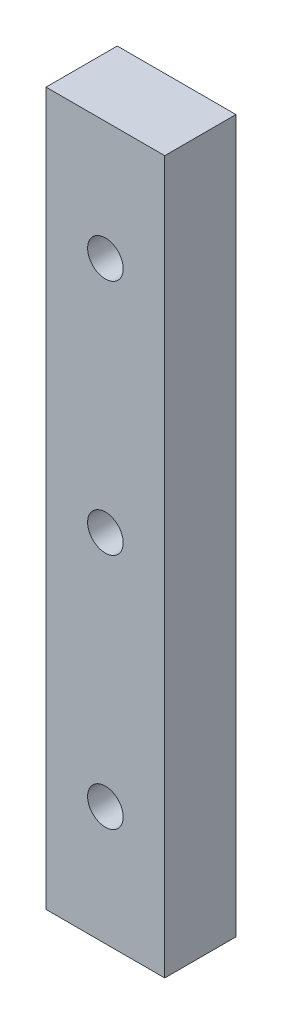
ISO-10303-21;
HEADER;
FILE_DESCRIPTION(('STEP AP214'),'2;1');
FILE_NAME('part.step','',(''),(''),'','','');
FILE_SCHEMA(('AUTOMOTIVE_DESIGN { 1 0 10303 214 1 1 1 1 }'));
ENDSEC;
DATA;
#1=APPLICATION_CONTEXT('core data for automotive mechanical design processes');
#2=APPLICATION_PROTOCOL_DEFINITION('international standard','automotive_design',2000,#1);
#3=PRODUCT_CONTEXT('',#1,'mechanical');
#4=PRODUCT('Part','Part','',(#3));
#5=PRODUCT_RELATED_PRODUCT_CATEGORY('part','',(#4));
#6=PRODUCT_DEFINITION_FORMATION('','',#4);
#7=PRODUCT_DEFINITION_CONTEXT('part definition',#1,'design');
#8=PRODUCT_DEFINITION('design','',#6,#7);
#9=PRODUCT_DEFINITION_SHAPE('','',#8);
#10=(LENGTH_UNIT() NAMED_UNIT(*) SI_UNIT(.MILLI.,.METRE.));
#11=(NAMED_UNIT(*) PLANE_ANGLE_UNIT() SI_UNIT($,.RADIAN.));
#12=(NAMED_UNIT(*) SI_UNIT($,.STERADIAN.) SOLID_ANGLE_UNIT());
#13=UNCERTAINTY_MEASURE_WITH_UNIT(LENGTH_MEASURE(1.E-05),#10,'distance_accuracy_value','');
#14=(GEOMETRIC_REPRESENTATION_CONTEXT(3) GLOBAL_UNCERTAINTY_ASSIGNED_CONTEXT((#13)) GLOBAL_UNIT_ASSIGNED_CONTEXT((#10,
#11,#12)) REPRESENTATION_CONTEXT('',''));
#15=CARTESIAN_POINT('',(0.,0.,0.));
#16=DIRECTION('',(0.,0.,1.));
#17=DIRECTION('',(1.,0.,0.));
#18=AXIS2_PLACEMENT_3D('',#15,#16,#17);
#19=CARTESIAN_POINT('',(5.,-30.,6.));
#20=DIRECTION('',(-1.,0.,0.));
#21=DIRECTION('',(0.,0.,1.));
#22=AXIS2_PLACEMENT_3D('',#19,#20,#21);
#23=PLANE('',#22);
#24=DIRECTION('',(0.,1.,0.));
#25=VECTOR('',#24,1.);
#26=CARTESIAN_POINT('',(5.,-30.,0.));
#27=LINE('',#26,#25);
#28=CARTESIAN_POINT('',(5.,-30.,0.));
#29=VERTEX_POINT('',#28);
#30=CARTESIAN_POINT('',(5.,30.,0.));
#31=VERTEX_POINT('',#30);
#32=EDGE_CURVE('E97',#29,#31,#27,.T.);
#33=ORIENTED_EDGE('',*,*,#32,.T.);
#34=DIRECTION('',(0.,0.,-1.));
#35=VECTOR('',#34,1.);
#36=CARTESIAN_POINT('',(5.,30.,6.));
#37=LINE('',#36,#35);
#38=CARTESIAN_POINT('',(5.,30.,6.));
#39=VERTEX_POINT('',#38);
#40=EDGE_CURVE('E11',#39,#31,#37,.T.);
#41=ORIENTED_EDGE('',*,*,#40,.F.);
#42=DIRECTION('',(0.,1.,0.));
#43=VECTOR('',#42,1.);
#44=CARTESIAN_POINT('',(5.,-30.,6.));
#45=LINE('',#44,#43);
#46=CARTESIAN_POINT('',(5.,-30.,6.));
#47=VERTEX_POINT('',#46);
#48=EDGE_CURVE('E84',#47,#39,#45,.T.);
#49=ORIENTED_EDGE('',*,*,#48,.F.);
#50=DIRECTION('',(0.,0.,-1.));
#51=VECTOR('',#50,1.);
#52=CARTESIAN_POINT('',(5.,-30.,6.));
#53=LINE('',#52,#51);
#54=EDGE_CURVE('E93',#47,#29,#53,.T.);
#55=ORIENTED_EDGE('',*,*,#54,.T.);
#56=EDGE_LOOP('',(#33,#41,#49,#55));
#57=FACE_BOUND('',#56,.T.);
#58=ADVANCED_FACE('F31',(#57),#23,.F.);
#59=CARTESIAN_POINT('',(-5.,30.,6.));
#60=DIRECTION('',(0.,-1.,0.));
#61=DIRECTION('',(0.,0.,-1.));
#62=AXIS2_PLACEMENT_3D('',#59,#60,#61);
#63=PLANE('',#62);
#64=DIRECTION('',(-1.,0.,0.));
#65=VECTOR('',#64,1.);
#66=CARTESIAN_POINT('',(-5.,30.,0.));
#67=LINE('',#66,#65);
#68=CARTESIAN_POINT('',(-5.,30.,0.));
#69=VERTEX_POINT('',#68);
#70=EDGE_CURVE('E88',#31,#69,#67,.T.);
#71=ORIENTED_EDGE('',*,*,#70,.T.);
#72=DIRECTION('',(0.,0.,-1.));
#73=VECTOR('',#72,1.);
#74=CARTESIAN_POINT('',(-5.,30.,6.));
#75=LINE('',#74,#73);
#76=CARTESIAN_POINT('',(-5.,30.,6.));
#77=VERTEX_POINT('',#76);
#78=EDGE_CURVE('E40',#77,#69,#75,.T.);
#79=ORIENTED_EDGE('',*,*,#78,.F.);
#80=DIRECTION('',(-1.,0.,0.));
#81=VECTOR('',#80,1.);
#82=CARTESIAN_POINT('',(-5.,30.,6.));
#83=LINE('',#82,#81);
#84=EDGE_CURVE('E79',#39,#77,#83,.T.);
#85=ORIENTED_EDGE('',*,*,#84,.F.);
#86=ORIENTED_EDGE('',*,*,#40,.T.);
#87=EDGE_LOOP('',(#71,#79,#85,#86));
#88=FACE_BOUND('',#87,.T.);
#89=ADVANCED_FACE('F87',(#88),#63,.F.);
#90=CARTESIAN_POINT('',(-5.,-30.,6.));
#91=DIRECTION('',(1.,0.,0.));
#92=DIRECTION('',(0.,0.,-1.));
#93=AXIS2_PLACEMENT_3D('',#90,#91,#92);
#94=PLANE('',#93);
#95=DIRECTION('',(0.,-1.,0.));
#96=VECTOR('',#95,1.);
#97=CARTESIAN_POINT('',(-5.,-30.,0.));
#98=LINE('',#97,#96);
#99=CARTESIAN_POINT('',(-5.,-30.,0.));
#100=VERTEX_POINT('',#99);
#101=EDGE_CURVE('E66',#69,#100,#98,.T.);
#102=ORIENTED_EDGE('',*,*,#101,.T.);
#103=DIRECTION('',(0.,0.,-1.));
#104=VECTOR('',#103,1.);
#105=CARTESIAN_POINT('',(-5.,-30.,6.));
#106=LINE('',#105,#104);
#107=CARTESIAN_POINT('',(-5.,-30.,6.));
#108=VERTEX_POINT('',#107);
#109=EDGE_CURVE('E89',#108,#100,#106,.T.);
#110=ORIENTED_EDGE('',*,*,#109,.F.);
#111=DIRECTION('',(0.,-1.,0.));
#112=VECTOR('',#111,1.);
#113=CARTESIAN_POINT('',(-5.,-30.,6.));
#114=LINE('',#113,#112);
#115=EDGE_CURVE('E82',#77,#108,#114,.T.);
#116=ORIENTED_EDGE('',*,*,#115,.F.);
#117=ORIENTED_EDGE('',*,*,#78,.T.);
#118=EDGE_LOOP('',(#102,#110,#116,#117));
#119=FACE_BOUND('',#118,.T.);
#120=ADVANCED_FACE('F91',(#119),#94,.F.);
#121=CARTESIAN_POINT('',(-5.,-30.,6.));
#122=DIRECTION('',(0.,1.,0.));
#123=DIRECTION('',(0.,0.,1.));
#124=AXIS2_PLACEMENT_3D('',#121,#122,#123);
#125=PLANE('',#124);
#126=DIRECTION('',(1.,0.,0.));
#127=VECTOR('',#126,1.);
#128=CARTESIAN_POINT('',(-5.,-30.,0.));
#129=LINE('',#128,#127);
#130=EDGE_CURVE('E72',#100,#29,#129,.T.);
#131=ORIENTED_EDGE('',*,*,#130,.T.);
#132=ORIENTED_EDGE('',*,*,#54,.F.);
#133=DIRECTION('',(1.,0.,0.));
#134=VECTOR('',#133,1.);
#135=CARTESIAN_POINT('',(-5.,-30.,6.));
#136=LINE('',#135,#134);
#137=EDGE_CURVE('E49',#108,#47,#136,.T.);
#138=ORIENTED_EDGE('',*,*,#137,.F.);
#139=ORIENTED_EDGE('',*,*,#109,.T.);
#140=EDGE_LOOP('',(#131,#132,#138,#139));
#141=FACE_BOUND('',#140,.T.);
#142=ADVANCED_FACE('F130',(#141),#125,.F.);
#143=CARTESIAN_POINT('',(5.,30.,6.));
#144=DIRECTION('',(0.,0.,-1.));
#145=DIRECTION('',(-1.,0.,0.));
#146=AXIS2_PLACEMENT_3D('',#143,#144,#145);
#147=PLANE('',#146);
#148=CARTESIAN_POINT('',(0.,20.0000000000001,6.));
#149=DIRECTION('',(0.,0.,1.));
#150=DIRECTION('',(1.,0.,0.));
#151=AXIS2_PLACEMENT_3D('',#148,#149,#150);
#152=CIRCLE('',#151,1.5);
#153=CARTESIAN_POINT('',(1.49999999999998,20.0000000000001,6.));
#154=VERTEX_POINT('',#153);
#155=EDGE_CURVE('E120',#154,#154,#152,.T.);
#156=ORIENTED_EDGE('',*,*,#155,.F.);
#157=EDGE_LOOP('',(#156));
#158=FACE_BOUND('',#157,.T.);
#159=CARTESIAN_POINT('',(0.,0.,6.));
#160=DIRECTION('',(0.,0.,1.));
#161=DIRECTION('',(1.,0.,0.));
#162=AXIS2_PLACEMENT_3D('',#159,#160,#161);
#163=CIRCLE('',#162,1.5);
#164=CARTESIAN_POINT('',(1.49999999999998,0.,6.));
#165=VERTEX_POINT('',#164);
#166=EDGE_CURVE('E110',#165,#165,#163,.T.);
#167=ORIENTED_EDGE('',*,*,#166,.F.);
#168=EDGE_LOOP('',(#167));
#169=FACE_BOUND('',#168,.T.);
#170=CARTESIAN_POINT('',(0.,-19.9999999999999,6.));
#171=DIRECTION('',(0.,0.,1.));
#172=DIRECTION('',(1.,0.,0.));
#173=AXIS2_PLACEMENT_3D('',#170,#171,#172);
#174=CIRCLE('',#173,1.5);
#175=CARTESIAN_POINT('',(1.49999999999999,-19.9999999999999,6.));
#176=VERTEX_POINT('',#175);
#177=EDGE_CURVE('E107',#176,#176,#174,.T.);
#178=ORIENTED_EDGE('',*,*,#177,.F.);
#179=EDGE_LOOP('',(#178));
#180=FACE_BOUND('',#179,.T.);
#181=ORIENTED_EDGE('',*,*,#48,.T.);
#182=ORIENTED_EDGE('',*,*,#84,.T.);
#183=ORIENTED_EDGE('',*,*,#115,.T.);
#184=ORIENTED_EDGE('',*,*,#137,.T.);
#185=EDGE_LOOP('',(#181,#182,#183,#184));
#186=FACE_BOUND('',#185,.T.);
#187=ADVANCED_FACE('F80',(#158,#169,#180,#186),#147,.F.);
#188=CARTESIAN_POINT('',(5.,30.,0.));
#189=DIRECTION('',(0.,0.,-1.));
#190=DIRECTION('',(-1.,0.,0.));
#191=AXIS2_PLACEMENT_3D('',#188,#189,#190);
#192=PLANE('',#191);
#193=CARTESIAN_POINT('',(0.,20.0000000000001,0.));
#194=DIRECTION('',(0.,0.,-1.));
#195=DIRECTION('',(-1.,0.,0.));
#196=AXIS2_PLACEMENT_3D('',#193,#194,#195);
#197=CIRCLE('',#196,1.5);
#198=CARTESIAN_POINT('',(-1.50000000000002,20.0000000000001,0.));
#199=VERTEX_POINT('',#198);
#200=EDGE_CURVE('E34',#199,#199,#197,.T.);
#201=ORIENTED_EDGE('',*,*,#200,.F.);
#202=EDGE_LOOP('',(#201));
#203=FACE_BOUND('',#202,.T.);
#204=CARTESIAN_POINT('',(0.,0.,0.));
#205=DIRECTION('',(0.,0.,-1.));
#206=DIRECTION('',(-1.,0.,0.));
#207=AXIS2_PLACEMENT_3D('',#204,#205,#206);
#208=CIRCLE('',#207,1.5);
#209=CARTESIAN_POINT('',(-1.50000000000002,0.,0.));
#210=VERTEX_POINT('',#209);
#211=EDGE_CURVE('E108',#210,#210,#208,.T.);
#212=ORIENTED_EDGE('',*,*,#211,.F.);
#213=EDGE_LOOP('',(#212));
#214=FACE_BOUND('',#213,.T.);
#215=CARTESIAN_POINT('',(0.,-19.9999999999999,0.));
#216=DIRECTION('',(0.,0.,-1.));
#217=DIRECTION('',(-1.,0.,0.));
#218=AXIS2_PLACEMENT_3D('',#215,#216,#217);
#219=CIRCLE('',#218,1.5);
#220=CARTESIAN_POINT('',(-1.50000000000002,-19.9999999999999,0.));
#221=VERTEX_POINT('',#220);
#222=EDGE_CURVE('E100',#221,#221,#219,.T.);
#223=ORIENTED_EDGE('',*,*,#222,.F.);
#224=EDGE_LOOP('',(#223));
#225=FACE_BOUND('',#224,.T.);
#226=ORIENTED_EDGE('',*,*,#32,.F.);
#227=ORIENTED_EDGE('',*,*,#130,.F.);
#228=ORIENTED_EDGE('',*,*,#101,.F.);
#229=ORIENTED_EDGE('',*,*,#70,.F.);
#230=EDGE_LOOP('',(#226,#227,#228,#229));
#231=FACE_BOUND('',#230,.T.);
#232=ADVANCED_FACE('F129',(#203,#214,#225,#231),#192,.T.);
#233=CARTESIAN_POINT('',(0.,-19.9999999999999,-4.));
#234=DIRECTION('',(0.,0.,1.));
#235=DIRECTION('',(1.,0.,0.));
#236=AXIS2_PLACEMENT_3D('',#233,#234,#235);
#237=CYLINDRICAL_SURFACE('',#236,1.5);
#238=ORIENTED_EDGE('',*,*,#222,.T.);
#239=EDGE_LOOP('',(#238));
#240=FACE_BOUND('',#239,.T.);
#241=ORIENTED_EDGE('',*,*,#177,.T.);
#242=EDGE_LOOP('',(#241));
#243=FACE_BOUND('',#242,.T.);
#244=ADVANCED_FACE('F135',(#240,#243),#237,.F.);
#245=CARTESIAN_POINT('',(0.,0.,-4.));
#246=DIRECTION('',(0.,0.,1.));
#247=DIRECTION('',(1.,0.,0.));
#248=AXIS2_PLACEMENT_3D('',#245,#246,#247);
#249=CYLINDRICAL_SURFACE('',#248,1.5);
#250=ORIENTED_EDGE('',*,*,#211,.T.);
#251=EDGE_LOOP('',(#250));
#252=FACE_BOUND('',#251,.T.);
#253=ORIENTED_EDGE('',*,*,#166,.T.);
#254=EDGE_LOOP('',(#253));
#255=FACE_BOUND('',#254,.T.);
#256=ADVANCED_FACE('F137',(#252,#255),#249,.F.);
#257=CARTESIAN_POINT('',(0.,20.0000000000001,-4.));
#258=DIRECTION('',(0.,0.,1.));
#259=DIRECTION('',(1.,0.,0.));
#260=AXIS2_PLACEMENT_3D('',#257,#258,#259);
#261=CYLINDRICAL_SURFACE('',#260,1.5);
#262=ORIENTED_EDGE('',*,*,#200,.T.);
#263=EDGE_LOOP('',(#262));
#264=FACE_BOUND('',#263,.T.);
#265=ORIENTED_EDGE('',*,*,#155,.T.);
#266=EDGE_LOOP('',(#265));
#267=FACE_BOUND('',#266,.T.);
#268=ADVANCED_FACE('F125',(#264,#267),#261,.F.);
#269=CLOSED_SHELL('',(#58,#89,#120,#142,#187,#232,#244,#256,#268));
#270=MANIFOLD_SOLID_BREP('B2',#269);
#271=ADVANCED_BREP_SHAPE_REPRESENTATION('',(#18,#270),#14);
#272=SHAPE_DEFINITION_REPRESENTATION(#9,#271);
ENDSEC;
END-ISO-10303-21;
